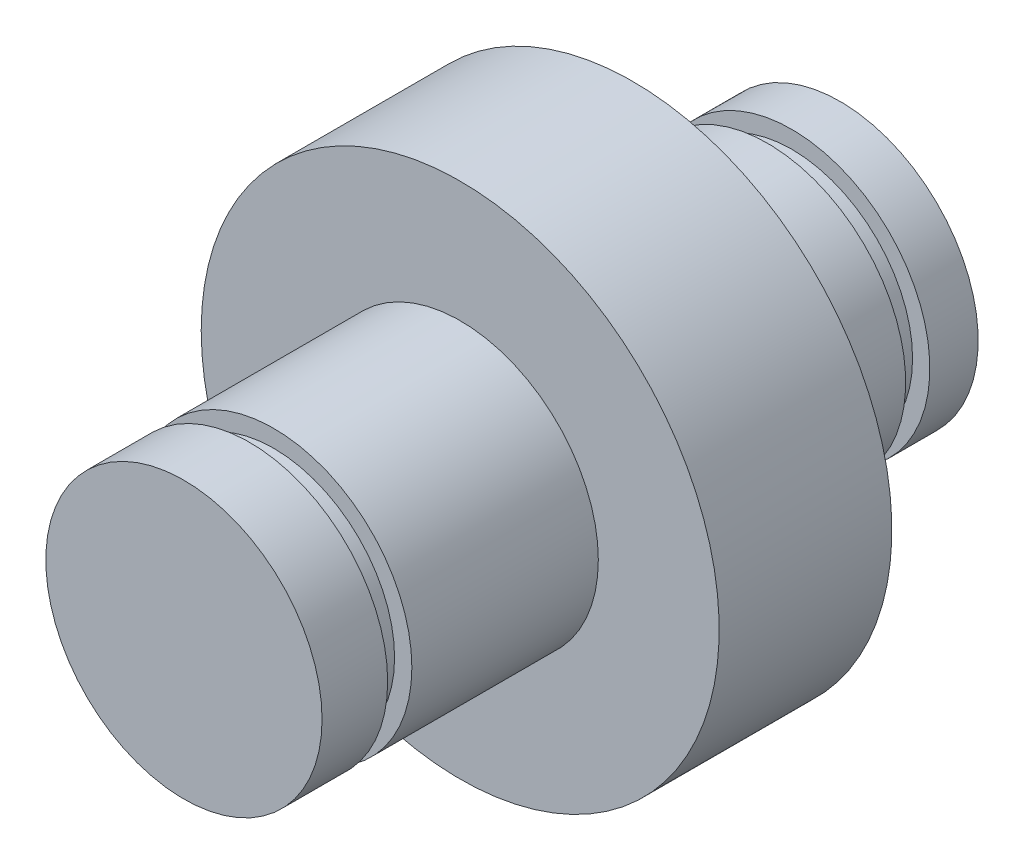
ISO-10303-21;
HEADER;
FILE_DESCRIPTION(('STEP AP214'),'2;1');
FILE_NAME('part.step','',(''),(''),'','','');
FILE_SCHEMA(('AUTOMOTIVE_DESIGN { 1 0 10303 214 1 1 1 1 }'));
ENDSEC;
DATA;
#1=APPLICATION_CONTEXT('core data for automotive mechanical design processes');
#2=APPLICATION_PROTOCOL_DEFINITION('international standard','automotive_design',2000,#1);
#3=PRODUCT_CONTEXT('',#1,'mechanical');
#4=PRODUCT('Part','Part','',(#3));
#5=PRODUCT_RELATED_PRODUCT_CATEGORY('part','',(#4));
#6=PRODUCT_DEFINITION_FORMATION('','',#4);
#7=PRODUCT_DEFINITION_CONTEXT('part definition',#1,'design');
#8=PRODUCT_DEFINITION('design','',#6,#7);
#9=PRODUCT_DEFINITION_SHAPE('','',#8);
#10=(LENGTH_UNIT() NAMED_UNIT(*) SI_UNIT(.MILLI.,.METRE.));
#11=(NAMED_UNIT(*) PLANE_ANGLE_UNIT() SI_UNIT($,.RADIAN.));
#12=(NAMED_UNIT(*) SI_UNIT($,.STERADIAN.) SOLID_ANGLE_UNIT());
#13=UNCERTAINTY_MEASURE_WITH_UNIT(LENGTH_MEASURE(1.E-05),#10,'distance_accuracy_value','');
#14=(GEOMETRIC_REPRESENTATION_CONTEXT(3) GLOBAL_UNCERTAINTY_ASSIGNED_CONTEXT((#13)) GLOBAL_UNIT_ASSIGNED_CONTEXT((#10,
#11,#12)) REPRESENTATION_CONTEXT('',''));
#15=CARTESIAN_POINT('',(0.,0.,0.));
#16=DIRECTION('',(0.,0.,1.));
#17=DIRECTION('',(1.,0.,0.));
#18=AXIS2_PLACEMENT_3D('',#15,#16,#17);
#19=CARTESIAN_POINT('',(0.,0.,8.));
#20=DIRECTION('',(0.,0.,-1.));
#21=DIRECTION('',(-1.,0.,0.));
#22=AXIS2_PLACEMENT_3D('',#19,#20,#21);
#23=CYLINDRICAL_SURFACE('',#22,4.);
#24=CARTESIAN_POINT('',(0.,0.,5.4));
#25=DIRECTION('',(0.,0.,1.));
#26=DIRECTION('',(1.,0.,0.));
#27=AXIS2_PLACEMENT_3D('',#24,#25,#26);
#28=CIRCLE('',#27,4.);
#29=CARTESIAN_POINT('',(4.,0.,5.4));
#30=VERTEX_POINT('',#29);
#31=EDGE_CURVE('E75',#30,#30,#28,.T.);
#32=ORIENTED_EDGE('',*,*,#31,.F.);
#33=EDGE_LOOP('',(#32));
#34=FACE_BOUND('',#33,.T.);
#35=CARTESIAN_POINT('',(0.,0.,0.));
#36=DIRECTION('',(0.,0.,1.));
#37=DIRECTION('',(1.,0.,0.));
#38=AXIS2_PLACEMENT_3D('',#35,#36,#37);
#39=CIRCLE('',#38,4.);
#40=CARTESIAN_POINT('',(4.,0.,0.));
#41=VERTEX_POINT('',#40);
#42=EDGE_CURVE('E39',#41,#41,#39,.T.);
#43=ORIENTED_EDGE('',*,*,#42,.T.);
#44=EDGE_LOOP('',(#43));
#45=FACE_BOUND('',#44,.T.);
#46=ADVANCED_FACE('F36',(#34,#45),#23,.T.);
#47=CARTESIAN_POINT('',(0.,0.,-5.));
#48=DIRECTION('',(0.,0.,1.));
#49=DIRECTION('',(1.,0.,0.));
#50=AXIS2_PLACEMENT_3D('',#47,#48,#49);
#51=CYLINDRICAL_SURFACE('',#50,7.5);
#52=CARTESIAN_POINT('',(0.,0.,-5.));
#53=DIRECTION('',(0.,0.,-1.));
#54=DIRECTION('',(-1.,0.,0.));
#55=AXIS2_PLACEMENT_3D('',#52,#53,#54);
#56=CIRCLE('',#55,7.5);
#57=CARTESIAN_POINT('',(-7.5,0.,-5.));
#58=VERTEX_POINT('',#57);
#59=EDGE_CURVE('E54',#58,#58,#56,.T.);
#60=ORIENTED_EDGE('',*,*,#59,.F.);
#61=EDGE_LOOP('',(#60));
#62=FACE_BOUND('',#61,.T.);
#63=CARTESIAN_POINT('',(0.,0.,0.));
#64=DIRECTION('',(0.,0.,-1.));
#65=DIRECTION('',(-1.,0.,0.));
#66=AXIS2_PLACEMENT_3D('',#63,#64,#65);
#67=CIRCLE('',#66,7.5);
#68=CARTESIAN_POINT('',(-7.5,0.,0.));
#69=VERTEX_POINT('',#68);
#70=EDGE_CURVE('E58',#69,#69,#67,.T.);
#71=ORIENTED_EDGE('',*,*,#70,.T.);
#72=EDGE_LOOP('',(#71));
#73=FACE_BOUND('',#72,.T.);
#74=ADVANCED_FACE('F127',(#62,#73),#51,.T.);
#75=CARTESIAN_POINT('',(0.,0.,-5.));
#76=DIRECTION('',(0.,0.,-1.));
#77=DIRECTION('',(-1.,0.,0.));
#78=AXIS2_PLACEMENT_3D('',#75,#76,#77);
#79=PLANE('',#78);
#80=CARTESIAN_POINT('',(0.,0.,-5.));
#81=DIRECTION('',(0.,0.,-1.));
#82=DIRECTION('',(-1.,0.,0.));
#83=AXIS2_PLACEMENT_3D('',#80,#81,#82);
#84=CIRCLE('',#83,4.);
#85=CARTESIAN_POINT('',(-4.,0.,-5.));
#86=VERTEX_POINT('',#85);
#87=EDGE_CURVE('E10',#86,#86,#84,.T.);
#88=ORIENTED_EDGE('',*,*,#87,.F.);
#89=EDGE_LOOP('',(#88));
#90=FACE_BOUND('',#89,.T.);
#91=ORIENTED_EDGE('',*,*,#59,.T.);
#92=EDGE_LOOP('',(#91));
#93=FACE_BOUND('',#92,.T.);
#94=ADVANCED_FACE('F118',(#90,#93),#79,.T.);
#95=CARTESIAN_POINT('',(0.,0.,0.));
#96=DIRECTION('',(0.,0.,-1.));
#97=DIRECTION('',(-1.,0.,0.));
#98=AXIS2_PLACEMENT_3D('',#95,#96,#97);
#99=PLANE('',#98);
#100=ORIENTED_EDGE('',*,*,#42,.F.);
#101=EDGE_LOOP('',(#100));
#102=FACE_BOUND('',#101,.T.);
#103=ORIENTED_EDGE('',*,*,#70,.F.);
#104=EDGE_LOOP('',(#103));
#105=FACE_BOUND('',#104,.T.);
#106=ADVANCED_FACE('F107',(#102,#105),#99,.F.);
#107=CARTESIAN_POINT('',(0.,0.,-11.));
#108=DIRECTION('',(0.,0.,1.));
#109=DIRECTION('',(1.,0.,0.));
#110=AXIS2_PLACEMENT_3D('',#107,#108,#109);
#111=CYLINDRICAL_SURFACE('',#110,4.);
#112=CARTESIAN_POINT('',(0.,0.,-8.9));
#113=DIRECTION('',(0.,0.,-1.));
#114=DIRECTION('',(-1.,0.,0.));
#115=AXIS2_PLACEMENT_3D('',#112,#113,#114);
#116=CIRCLE('',#115,4.);
#117=CARTESIAN_POINT('',(-4.,0.,-8.9));
#118=VERTEX_POINT('',#117);
#119=EDGE_CURVE('E97',#118,#118,#116,.T.);
#120=ORIENTED_EDGE('',*,*,#119,.F.);
#121=EDGE_LOOP('',(#120));
#122=FACE_BOUND('',#121,.T.);
#123=ORIENTED_EDGE('',*,*,#87,.T.);
#124=EDGE_LOOP('',(#123));
#125=FACE_BOUND('',#124,.T.);
#126=ADVANCED_FACE('F104',(#122,#125),#111,.T.);
#127=CARTESIAN_POINT('',(-4.,0.,6.1));
#128=DIRECTION('',(0.,0.,-1.));
#129=DIRECTION('',(-1.,0.,0.));
#130=AXIS2_PLACEMENT_3D('',#127,#128,#129);
#131=PLANE('',#130);
#132=CARTESIAN_POINT('',(0.,0.,6.1));
#133=DIRECTION('',(0.,0.,1.));
#134=DIRECTION('',(1.,0.,0.));
#135=AXIS2_PLACEMENT_3D('',#132,#133,#134);
#136=CIRCLE('',#135,3.5);
#137=CARTESIAN_POINT('',(3.5,0.,6.1));
#138=VERTEX_POINT('',#137);
#139=EDGE_CURVE('E65',#138,#138,#136,.T.);
#140=ORIENTED_EDGE('',*,*,#139,.T.);
#141=EDGE_LOOP('',(#140));
#142=FACE_BOUND('',#141,.T.);
#143=CARTESIAN_POINT('',(0.,0.,6.1));
#144=DIRECTION('',(0.,0.,1.));
#145=DIRECTION('',(1.,0.,0.));
#146=AXIS2_PLACEMENT_3D('',#143,#144,#145);
#147=CIRCLE('',#146,4.);
#148=CARTESIAN_POINT('',(4.,0.,6.1));
#149=VERTEX_POINT('',#148);
#150=EDGE_CURVE('E81',#149,#149,#147,.T.);
#151=ORIENTED_EDGE('',*,*,#150,.F.);
#152=EDGE_LOOP('',(#151));
#153=FACE_BOUND('',#152,.T.);
#154=ADVANCED_FACE('F106',(#142,#153),#131,.T.);
#155=CARTESIAN_POINT('',(0.,0.,8.));
#156=DIRECTION('',(0.,0.,1.));
#157=DIRECTION('',(1.,0.,0.));
#158=AXIS2_PLACEMENT_3D('',#155,#156,#157);
#159=CYLINDRICAL_SURFACE('',#158,3.5);
#160=CARTESIAN_POINT('',(0.,0.,5.4));
#161=DIRECTION('',(0.,0.,1.));
#162=DIRECTION('',(1.,0.,0.));
#163=AXIS2_PLACEMENT_3D('',#160,#161,#162);
#164=CIRCLE('',#163,3.5);
#165=CARTESIAN_POINT('',(3.5,0.,5.4));
#166=VERTEX_POINT('',#165);
#167=EDGE_CURVE('E70',#166,#166,#164,.T.);
#168=ORIENTED_EDGE('',*,*,#167,.T.);
#169=EDGE_LOOP('',(#168));
#170=FACE_BOUND('',#169,.T.);
#171=ORIENTED_EDGE('',*,*,#139,.F.);
#172=EDGE_LOOP('',(#171));
#173=FACE_BOUND('',#172,.T.);
#174=ADVANCED_FACE('F115',(#170,#173),#159,.T.);
#175=CARTESIAN_POINT('',(-4.,0.,5.4));
#176=DIRECTION('',(0.,0.,-1.));
#177=DIRECTION('',(-1.,0.,0.));
#178=AXIS2_PLACEMENT_3D('',#175,#176,#177);
#179=PLANE('',#178);
#180=ORIENTED_EDGE('',*,*,#167,.F.);
#181=EDGE_LOOP('',(#180));
#182=FACE_BOUND('',#181,.T.);
#183=ORIENTED_EDGE('',*,*,#31,.T.);
#184=EDGE_LOOP('',(#183));
#185=FACE_BOUND('',#184,.T.);
#186=ADVANCED_FACE('F147',(#182,#185),#179,.F.);
#187=CARTESIAN_POINT('',(0.,0.,8.));
#188=DIRECTION('',(0.,0.,1.));
#189=DIRECTION('',(1.,0.,0.));
#190=AXIS2_PLACEMENT_3D('',#187,#188,#189);
#191=PLANE('',#190);
#192=CARTESIAN_POINT('',(0.,0.,8.));
#193=DIRECTION('',(0.,0.,1.));
#194=DIRECTION('',(1.,0.,0.));
#195=AXIS2_PLACEMENT_3D('',#192,#193,#194);
#196=CIRCLE('',#195,4.);
#197=CARTESIAN_POINT('',(4.,0.,8.));
#198=VERTEX_POINT('',#197);
#199=EDGE_CURVE('E44',#198,#198,#196,.T.);
#200=ORIENTED_EDGE('',*,*,#199,.T.);
#201=EDGE_LOOP('',(#200));
#202=FACE_BOUND('',#201,.T.);
#203=ADVANCED_FACE('F138',(#202),#191,.T.);
#204=ORIENTED_EDGE('',*,*,#199,.F.);
#205=EDGE_LOOP('',(#204));
#206=FACE_BOUND('',#205,.T.);
#207=ORIENTED_EDGE('',*,*,#150,.T.);
#208=EDGE_LOOP('',(#207));
#209=FACE_BOUND('',#208,.T.);
#210=ADVANCED_FACE('F129',(#206,#209),#23,.T.);
#211=CARTESIAN_POINT('',(0.,0.,-8.9));
#212=DIRECTION('',(0.,0.,1.));
#213=DIRECTION('',(1.,0.,0.));
#214=AXIS2_PLACEMENT_3D('',#211,#212,#213);
#215=PLANE('',#214);
#216=CARTESIAN_POINT('',(0.,0.,-8.9));
#217=DIRECTION('',(0.,0.,-1.));
#218=DIRECTION('',(-1.,0.,0.));
#219=AXIS2_PLACEMENT_3D('',#216,#217,#218);
#220=CIRCLE('',#219,3.5);
#221=CARTESIAN_POINT('',(-3.5,0.,-8.9));
#222=VERTEX_POINT('',#221);
#223=EDGE_CURVE('E85',#222,#222,#220,.T.);
#224=ORIENTED_EDGE('',*,*,#223,.F.);
#225=EDGE_LOOP('',(#224));
#226=FACE_BOUND('',#225,.T.);
#227=ORIENTED_EDGE('',*,*,#119,.T.);
#228=EDGE_LOOP('',(#227));
#229=FACE_BOUND('',#228,.T.);
#230=ADVANCED_FACE('F102',(#226,#229),#215,.F.);
#231=CARTESIAN_POINT('',(0.,0.,-11.));
#232=DIRECTION('',(0.,0.,-1.));
#233=DIRECTION('',(-1.,0.,0.));
#234=AXIS2_PLACEMENT_3D('',#231,#232,#233);
#235=CYLINDRICAL_SURFACE('',#234,3.5);
#236=CARTESIAN_POINT('',(0.,0.,-9.6));
#237=DIRECTION('',(0.,0.,-1.));
#238=DIRECTION('',(-1.,0.,0.));
#239=AXIS2_PLACEMENT_3D('',#236,#237,#238);
#240=CIRCLE('',#239,3.5);
#241=CARTESIAN_POINT('',(-3.5,0.,-9.6));
#242=VERTEX_POINT('',#241);
#243=EDGE_CURVE('E89',#242,#242,#240,.T.);
#244=ORIENTED_EDGE('',*,*,#243,.F.);
#245=EDGE_LOOP('',(#244));
#246=FACE_BOUND('',#245,.T.);
#247=ORIENTED_EDGE('',*,*,#223,.T.);
#248=EDGE_LOOP('',(#247));
#249=FACE_BOUND('',#248,.T.);
#250=ADVANCED_FACE('F144',(#246,#249),#235,.T.);
#251=CARTESIAN_POINT('',(0.,0.,-9.6));
#252=DIRECTION('',(0.,0.,1.));
#253=DIRECTION('',(1.,0.,0.));
#254=AXIS2_PLACEMENT_3D('',#251,#252,#253);
#255=PLANE('',#254);
#256=ORIENTED_EDGE('',*,*,#243,.T.);
#257=EDGE_LOOP('',(#256));
#258=FACE_BOUND('',#257,.T.);
#259=CARTESIAN_POINT('',(0.,0.,-9.6));
#260=DIRECTION('',(0.,0.,-1.));
#261=DIRECTION('',(-1.,0.,0.));
#262=AXIS2_PLACEMENT_3D('',#259,#260,#261);
#263=CIRCLE('',#262,4.);
#264=CARTESIAN_POINT('',(-4.,0.,-9.6));
#265=VERTEX_POINT('',#264);
#266=EDGE_CURVE('E93',#265,#265,#263,.T.);
#267=ORIENTED_EDGE('',*,*,#266,.F.);
#268=EDGE_LOOP('',(#267));
#269=FACE_BOUND('',#268,.T.);
#270=ADVANCED_FACE('F180',(#258,#269),#255,.T.);
#271=CARTESIAN_POINT('',(0.,0.,-11.));
#272=DIRECTION('',(0.,0.,-1.));
#273=DIRECTION('',(-1.,0.,0.));
#274=AXIS2_PLACEMENT_3D('',#271,#272,#273);
#275=PLANE('',#274);
#276=CARTESIAN_POINT('',(0.,0.,-11.));
#277=DIRECTION('',(0.,0.,-1.));
#278=DIRECTION('',(-1.,0.,0.));
#279=AXIS2_PLACEMENT_3D('',#276,#277,#278);
#280=CIRCLE('',#279,4.);
#281=CARTESIAN_POINT('',(-4.,0.,-11.));
#282=VERTEX_POINT('',#281);
#283=EDGE_CURVE('E52',#282,#282,#280,.T.);
#284=ORIENTED_EDGE('',*,*,#283,.T.);
#285=EDGE_LOOP('',(#284));
#286=FACE_BOUND('',#285,.T.);
#287=ADVANCED_FACE('F124',(#286),#275,.T.);
#288=ORIENTED_EDGE('',*,*,#283,.F.);
#289=EDGE_LOOP('',(#288));
#290=FACE_BOUND('',#289,.T.);
#291=ORIENTED_EDGE('',*,*,#266,.T.);
#292=EDGE_LOOP('',(#291));
#293=FACE_BOUND('',#292,.T.);
#294=ADVANCED_FACE('F109',(#290,#293),#111,.T.);
#295=CLOSED_SHELL('',(#46,#74,#94,#106,#126,#154,#174,#186,#203,#210,#230,#250,#270,#287,#294));
#296=MANIFOLD_SOLID_BREP('B2',#295);
#297=ADVANCED_BREP_SHAPE_REPRESENTATION('',(#18,#296),#14);
#298=SHAPE_DEFINITION_REPRESENTATION(#9,#297);
ENDSEC;
END-ISO-10303-21;
